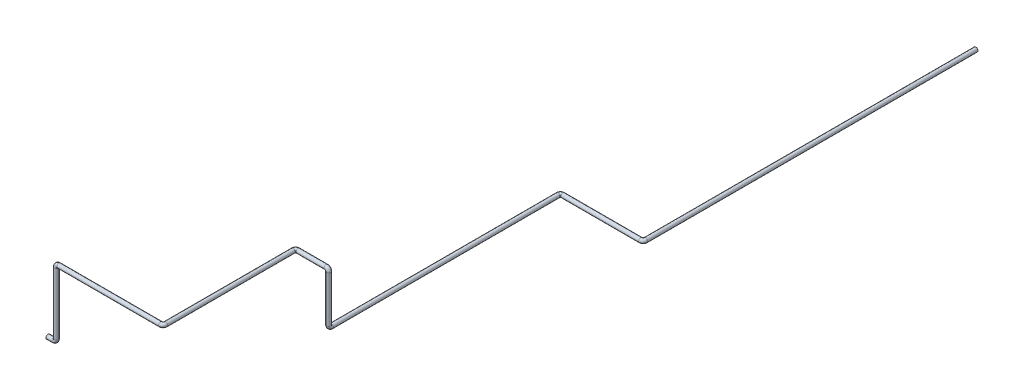
ISO-10303-21;
HEADER;
FILE_DESCRIPTION(('STEP AP214'),'2;1');
FILE_NAME('part.step','',(''),(''),'','','');
FILE_SCHEMA(('AUTOMOTIVE_DESIGN { 1 0 10303 214 1 1 1 1 }'));
ENDSEC;
DATA;
#1=APPLICATION_CONTEXT('core data for automotive mechanical design processes');
#2=APPLICATION_PROTOCOL_DEFINITION('international standard','automotive_design',2000,#1);
#3=PRODUCT_CONTEXT('',#1,'mechanical');
#4=PRODUCT('Part','Part','',(#3));
#5=PRODUCT_RELATED_PRODUCT_CATEGORY('part','',(#4));
#6=PRODUCT_DEFINITION_FORMATION('','',#4);
#7=PRODUCT_DEFINITION_CONTEXT('part definition',#1,'design');
#8=PRODUCT_DEFINITION('design','',#6,#7);
#9=PRODUCT_DEFINITION_SHAPE('','',#8);
#10=(LENGTH_UNIT() NAMED_UNIT(*) SI_UNIT(.MILLI.,.METRE.));
#11=(NAMED_UNIT(*) PLANE_ANGLE_UNIT() SI_UNIT($,.RADIAN.));
#12=(NAMED_UNIT(*) SI_UNIT($,.STERADIAN.) SOLID_ANGLE_UNIT());
#13=UNCERTAINTY_MEASURE_WITH_UNIT(LENGTH_MEASURE(1.E-05),#10,'distance_accuracy_value','');
#14=(GEOMETRIC_REPRESENTATION_CONTEXT(3) GLOBAL_UNCERTAINTY_ASSIGNED_CONTEXT((#13)) GLOBAL_UNIT_ASSIGNED_CONTEXT((#10,
#11,#12)) REPRESENTATION_CONTEXT('',''));
#15=CARTESIAN_POINT('',(0.,0.,0.));
#16=DIRECTION('',(0.,0.,1.));
#17=DIRECTION('',(1.,0.,0.));
#18=AXIS2_PLACEMENT_3D('',#15,#16,#17);
#19=CARTESIAN_POINT('',(0.,0.,10.));
#20=DIRECTION('',(0.,0.,-1.));
#21=DIRECTION('',(-1.,0.,0.));
#22=AXIS2_PLACEMENT_3D('',#19,#20,#21);
#23=CYLINDRICAL_SURFACE('',#22,12.7);
#24=CARTESIAN_POINT('',(0.,0.,0.999999999999999));
#25=DIRECTION('',(0.,0.,1.));
#26=DIRECTION('',(1.,0.,0.));
#27=AXIS2_PLACEMENT_3D('',#24,#25,#26);
#28=CIRCLE('',#27,12.7);
#29=CARTESIAN_POINT('',(0.0462735866728176,12.6999156987429,0.999999999999999));
#30=VERTEX_POINT('',#29);
#31=CARTESIAN_POINT('',(-0.0462735866728176,12.6999156987429,0.999999999999999));
#32=VERTEX_POINT('',#31);
#33=EDGE_CURVE('E11',#30,#32,#28,.T.);
#34=ORIENTED_EDGE('',*,*,#33,.T.);
#35=DIRECTION('',(0.,0.,-1.));
#36=VECTOR('',#35,1.);
#37=CARTESIAN_POINT('',(-0.0462735866728176,12.6999156987429,10.));
#38=LINE('',#37,#36);
#39=CARTESIAN_POINT('',(-0.0462735866728176,12.6999156987429,0.));
#40=VERTEX_POINT('',#39);
#41=EDGE_CURVE('E81',#32,#40,#38,.T.);
#42=ORIENTED_EDGE('',*,*,#41,.T.);
#43=CARTESIAN_POINT('',(0.,0.,0.));
#44=DIRECTION('',(0.,0.,1.));
#45=DIRECTION('',(1.,0.,0.));
#46=AXIS2_PLACEMENT_3D('',#43,#44,#45);
#47=CIRCLE('',#46,12.7);
#48=CARTESIAN_POINT('',(0.0462735866728176,12.6999156987429,0.));
#49=VERTEX_POINT('',#48);
#50=EDGE_CURVE('E42',#40,#49,#47,.T.);
#51=ORIENTED_EDGE('',*,*,#50,.T.);
#52=DIRECTION('',(0.,0.,-1.));
#53=VECTOR('',#52,1.);
#54=CARTESIAN_POINT('',(0.0462735866728176,12.6999156987429,10.));
#55=LINE('',#54,#53);
#56=EDGE_CURVE('E52',#49,#30,#55,.F.);
#57=ORIENTED_EDGE('',*,*,#56,.T.);
#58=EDGE_LOOP('',(#34,#42,#51,#57));
#59=FACE_BOUND('',#58,.T.);
#60=CARTESIAN_POINT('',(0.,0.,1995.));
#61=DIRECTION('',(0.,0.,1.));
#62=DIRECTION('',(1.,0.,0.));
#63=AXIS2_PLACEMENT_3D('',#60,#61,#62);
#64=CIRCLE('',#63,12.7);
#65=CARTESIAN_POINT('',(12.7,0.,1995.));
#66=VERTEX_POINT('',#65);
#67=EDGE_CURVE('E109',#66,#66,#64,.T.);
#68=ORIENTED_EDGE('',*,*,#67,.F.);
#69=EDGE_LOOP('',(#68));
#70=FACE_BOUND('',#69,.T.);
#71=ADVANCED_FACE('F35',(#59,#70),#23,.T.);
#72=CARTESIAN_POINT('',(0.,0.,0.));
#73=DIRECTION('',(0.,0.,1.));
#74=DIRECTION('',(1.,0.,0.));
#75=AXIS2_PLACEMENT_3D('',#72,#73,#74);
#76=PLANE('',#75);
#77=ORIENTED_EDGE('',*,*,#50,.F.);
#78=DIRECTION('',(0.,1.,0.));
#79=VECTOR('',#78,1.);
#80=CARTESIAN_POINT('',(-0.0462735866728176,12.675138552317,0.));
#81=LINE('',#80,#79);
#82=CARTESIAN_POINT('',(-0.0462735866728176,12.724861447683,0.));
#83=VERTEX_POINT('',#82);
#84=EDGE_CURVE('E101',#40,#83,#81,.T.);
#85=ORIENTED_EDGE('',*,*,#84,.T.);
#86=DIRECTION('',(1.,0.,0.));
#87=VECTOR('',#86,1.);
#88=CARTESIAN_POINT('',(0.0462735866728176,12.724861447683,0.));
#89=LINE('',#88,#87);
#90=CARTESIAN_POINT('',(0.0462735866728176,12.724861447683,0.));
#91=VERTEX_POINT('',#90);
#92=EDGE_CURVE('E91',#83,#91,#89,.T.);
#93=ORIENTED_EDGE('',*,*,#92,.T.);
#94=DIRECTION('',(0.,-1.,0.));
#95=VECTOR('',#94,1.);
#96=CARTESIAN_POINT('',(0.0462735866728176,12.675138552317,0.));
#97=LINE('',#96,#95);
#98=EDGE_CURVE('E85',#91,#49,#97,.T.);
#99=ORIENTED_EDGE('',*,*,#98,.T.);
#100=EDGE_LOOP('',(#77,#85,#93,#99));
#101=FACE_BOUND('',#100,.T.);
#102=ADVANCED_FACE('F163',(#101),#76,.F.);
#103=CARTESIAN_POINT('',(-1395.,-95.,4210.));
#104=DIRECTION('',(-1.,0.,0.));
#105=DIRECTION('',(0.,1.,0.));
#106=AXIS2_PLACEMENT_3D('',#103,#104,#105);
#107=PLANE('',#106);
#108=CARTESIAN_POINT('',(-1395.,-95.,4210.));
#109=DIRECTION('',(-1.,0.,0.));
#110=DIRECTION('',(0.,1.,0.));
#111=AXIS2_PLACEMENT_3D('',#108,#109,#110);
#112=CIRCLE('',#111,12.7);
#113=CARTESIAN_POINT('',(-1395.,-82.3,4210.));
#114=VERTEX_POINT('',#113);
#115=EDGE_CURVE('E157',#114,#114,#112,.T.);
#116=ORIENTED_EDGE('',*,*,#115,.T.);
#117=EDGE_LOOP('',(#116));
#118=FACE_BOUND('',#117,.T.);
#119=ADVANCED_FACE('F165',(#118),#107,.T.);
#120=CARTESIAN_POINT('',(-15.,0.,1995.));
#121=DIRECTION('',(0.,-1.,0.));
#122=DIRECTION('',(0.,0.,-1.));
#123=AXIS2_PLACEMENT_3D('',#120,#121,#122);
#124=TOROIDAL_SURFACE('',#123,15.,12.7);
#125=CARTESIAN_POINT('',(-15.,0.,2010.));
#126=DIRECTION('',(-1.,0.,0.));
#127=DIRECTION('',(0.,0.,1.));
#128=AXIS2_PLACEMENT_3D('',#125,#126,#127);
#129=CIRCLE('',#128,12.7);
#130=CARTESIAN_POINT('',(-15.,0.,2022.7));
#131=VERTEX_POINT('',#130);
#132=EDGE_CURVE('E112',#131,#131,#129,.T.);
#133=CARTESIAN_POINT('',(-15.,0.,1995.));
#134=DIRECTION('',(0.,-1.,0.));
#135=DIRECTION('',(0.,0.,-1.));
#136=AXIS2_PLACEMENT_3D('',#133,#134,#135);
#137=CIRCLE('',#136,27.6999999999999);
#138=EDGE_CURVE('',#66,#131,#137,.T.);
#139=ORIENTED_EDGE('',*,*,#67,.T.);
#140=ORIENTED_EDGE('',*,*,#132,.F.);
#141=ORIENTED_EDGE('',*,*,#138,.T.);
#142=ORIENTED_EDGE('',*,*,#138,.F.);
#143=EDGE_LOOP('',(#139,#141,#140,#142));
#144=FACE_BOUND('',#143,.T.);
#145=ADVANCED_FACE('F171',(#144),#124,.T.);
#146=CARTESIAN_POINT('',(-15.,0.,2010.));
#147=DIRECTION('',(-1.,0.,0.));
#148=DIRECTION('',(0.,0.,1.));
#149=AXIS2_PLACEMENT_3D('',#146,#147,#148);
#150=CYLINDRICAL_SURFACE('',#149,12.7);
#151=CARTESIAN_POINT('',(-485.,0.,2010.));
#152=DIRECTION('',(-1.,0.,0.));
#153=DIRECTION('',(0.,0.,1.));
#154=AXIS2_PLACEMENT_3D('',#151,#152,#153);
#155=CIRCLE('',#154,12.7);
#156=CARTESIAN_POINT('',(-485.,0.,1997.3));
#157=VERTEX_POINT('',#156);
#158=EDGE_CURVE('E115',#157,#157,#155,.T.);
#159=ORIENTED_EDGE('',*,*,#158,.F.);
#160=EDGE_LOOP('',(#159));
#161=FACE_BOUND('',#160,.T.);
#162=ORIENTED_EDGE('',*,*,#132,.T.);
#163=EDGE_LOOP('',(#162));
#164=FACE_BOUND('',#163,.T.);
#165=ADVANCED_FACE('F235',(#161,#164),#150,.T.);
#166=CARTESIAN_POINT('',(-485.,0.,2025.));
#167=DIRECTION('',(0.,1.,0.));
#168=DIRECTION('',(0.,0.,1.));
#169=AXIS2_PLACEMENT_3D('',#166,#167,#168);
#170=TOROIDAL_SURFACE('',#169,15.0000000000001,12.7);
#171=CARTESIAN_POINT('',(-500.,0.,2025.));
#172=DIRECTION('',(0.,0.,1.));
#173=DIRECTION('',(1.,0.,0.));
#174=AXIS2_PLACEMENT_3D('',#171,#172,#173);
#175=CIRCLE('',#174,12.7);
#176=CARTESIAN_POINT('',(-512.7,0.,2025.));
#177=VERTEX_POINT('',#176);
#178=EDGE_CURVE('E118',#177,#177,#175,.T.);
#179=CARTESIAN_POINT('',(-485.,0.,2025.));
#180=DIRECTION('',(0.,1.,0.));
#181=DIRECTION('',(0.,0.,1.));
#182=AXIS2_PLACEMENT_3D('',#179,#180,#181);
#183=CIRCLE('',#182,27.7000000000001);
#184=EDGE_CURVE('',#157,#177,#183,.T.);
#185=ORIENTED_EDGE('',*,*,#158,.T.);
#186=ORIENTED_EDGE('',*,*,#178,.F.);
#187=ORIENTED_EDGE('',*,*,#184,.T.);
#188=ORIENTED_EDGE('',*,*,#184,.F.);
#189=EDGE_LOOP('',(#185,#187,#186,#188));
#190=FACE_BOUND('',#189,.T.);
#191=ADVANCED_FACE('F231',(#190),#170,.T.);
#192=CARTESIAN_POINT('',(-500.,0.,2025.));
#193=DIRECTION('',(0.,0.,1.));
#194=DIRECTION('',(1.,0.,0.));
#195=AXIS2_PLACEMENT_3D('',#192,#193,#194);
#196=CYLINDRICAL_SURFACE('',#195,12.7);
#197=CARTESIAN_POINT('',(-500.,0.,3395.));
#198=DIRECTION('',(0.,0.,1.));
#199=DIRECTION('',(1.,0.,0.));
#200=AXIS2_PLACEMENT_3D('',#197,#198,#199);
#201=CIRCLE('',#200,12.7);
#202=CARTESIAN_POINT('',(-500.,-12.7000000000004,3395.));
#203=VERTEX_POINT('',#202);
#204=EDGE_CURVE('E121',#203,#203,#201,.T.);
#205=ORIENTED_EDGE('',*,*,#204,.F.);
#206=EDGE_LOOP('',(#205));
#207=FACE_BOUND('',#206,.T.);
#208=ORIENTED_EDGE('',*,*,#178,.T.);
#209=EDGE_LOOP('',(#208));
#210=FACE_BOUND('',#209,.T.);
#211=ADVANCED_FACE('F227',(#207,#210),#196,.T.);
#212=CARTESIAN_POINT('',(-500.,15.,3395.));
#213=DIRECTION('',(-1.,0.,0.));
#214=DIRECTION('',(0.,0.,1.));
#215=AXIS2_PLACEMENT_3D('',#212,#213,#214);
#216=TOROIDAL_SURFACE('',#215,15.0000000000004,12.7);
#217=CARTESIAN_POINT('',(-500.,15.,3410.));
#218=DIRECTION('',(0.,1.,0.));
#219=DIRECTION('',(1.,0.,0.));
#220=AXIS2_PLACEMENT_3D('',#217,#218,#219);
#221=CIRCLE('',#220,12.7);
#222=CARTESIAN_POINT('',(-500.,15.,3422.7));
#223=VERTEX_POINT('',#222);
#224=EDGE_CURVE('E124',#223,#223,#221,.T.);
#225=CARTESIAN_POINT('',(-500.,15.,3395.));
#226=DIRECTION('',(-1.,0.,0.));
#227=DIRECTION('',(0.,0.,1.));
#228=AXIS2_PLACEMENT_3D('',#225,#226,#227);
#229=CIRCLE('',#228,27.7000000000004);
#230=EDGE_CURVE('',#203,#223,#229,.T.);
#231=ORIENTED_EDGE('',*,*,#204,.T.);
#232=ORIENTED_EDGE('',*,*,#224,.F.);
#233=ORIENTED_EDGE('',*,*,#230,.T.);
#234=ORIENTED_EDGE('',*,*,#230,.F.);
#235=EDGE_LOOP('',(#231,#233,#232,#234));
#236=FACE_BOUND('',#235,.T.);
#237=ADVANCED_FACE('F223',(#236),#216,.T.);
#238=CARTESIAN_POINT('',(-500.,15.,3410.));
#239=DIRECTION('',(0.,1.,0.));
#240=DIRECTION('',(0.,0.,1.));
#241=AXIS2_PLACEMENT_3D('',#238,#239,#240);
#242=CYLINDRICAL_SURFACE('',#241,12.7);
#243=CARTESIAN_POINT('',(-500.,295.,3410.));
#244=DIRECTION('',(0.,1.,0.));
#245=DIRECTION('',(1.,0.,0.));
#246=AXIS2_PLACEMENT_3D('',#243,#244,#245);
#247=CIRCLE('',#246,12.7);
#248=CARTESIAN_POINT('',(-487.3,295.,3410.));
#249=VERTEX_POINT('',#248);
#250=EDGE_CURVE('E127',#249,#249,#247,.T.);
#251=ORIENTED_EDGE('',*,*,#250,.F.);
#252=EDGE_LOOP('',(#251));
#253=FACE_BOUND('',#252,.T.);
#254=ORIENTED_EDGE('',*,*,#224,.T.);
#255=EDGE_LOOP('',(#254));
#256=FACE_BOUND('',#255,.T.);
#257=ADVANCED_FACE('F219',(#253,#256),#242,.T.);
#258=CARTESIAN_POINT('',(-515.,295.,3410.));
#259=DIRECTION('',(0.,0.,1.));
#260=DIRECTION('',(1.,0.,0.));
#261=AXIS2_PLACEMENT_3D('',#258,#259,#260);
#262=TOROIDAL_SURFACE('',#261,15.,12.7);
#263=CARTESIAN_POINT('',(-515.,310.,3410.));
#264=DIRECTION('',(-1.,0.,0.));
#265=DIRECTION('',(0.,1.,0.));
#266=AXIS2_PLACEMENT_3D('',#263,#264,#265);
#267=CIRCLE('',#266,12.7);
#268=CARTESIAN_POINT('',(-515.,322.7,3410.));
#269=VERTEX_POINT('',#268);
#270=EDGE_CURVE('E130',#269,#269,#267,.T.);
#271=CARTESIAN_POINT('',(-515.,295.,3410.));
#272=DIRECTION('',(0.,0.,1.));
#273=DIRECTION('',(1.,0.,0.));
#274=AXIS2_PLACEMENT_3D('',#271,#272,#273);
#275=CIRCLE('',#274,27.7);
#276=EDGE_CURVE('',#249,#269,#275,.T.);
#277=ORIENTED_EDGE('',*,*,#250,.T.);
#278=ORIENTED_EDGE('',*,*,#270,.F.);
#279=ORIENTED_EDGE('',*,*,#276,.T.);
#280=ORIENTED_EDGE('',*,*,#276,.F.);
#281=EDGE_LOOP('',(#277,#279,#278,#280));
#282=FACE_BOUND('',#281,.T.);
#283=ADVANCED_FACE('F215',(#282),#262,.T.);
#284=CARTESIAN_POINT('',(-515.,310.,3410.));
#285=DIRECTION('',(-1.,0.,0.));
#286=DIRECTION('',(0.,0.,1.));
#287=AXIS2_PLACEMENT_3D('',#284,#285,#286);
#288=CYLINDRICAL_SURFACE('',#287,12.7);
#289=CARTESIAN_POINT('',(-685.,310.,3410.));
#290=DIRECTION('',(-1.,0.,0.));
#291=DIRECTION('',(0.,1.,0.));
#292=AXIS2_PLACEMENT_3D('',#289,#290,#291);
#293=CIRCLE('',#292,12.7);
#294=CARTESIAN_POINT('',(-685.,310.,3397.3));
#295=VERTEX_POINT('',#294);
#296=EDGE_CURVE('E133',#295,#295,#293,.T.);
#297=ORIENTED_EDGE('',*,*,#296,.F.);
#298=EDGE_LOOP('',(#297));
#299=FACE_BOUND('',#298,.T.);
#300=ORIENTED_EDGE('',*,*,#270,.T.);
#301=EDGE_LOOP('',(#300));
#302=FACE_BOUND('',#301,.T.);
#303=ADVANCED_FACE('F211',(#299,#302),#288,.T.);
#304=CARTESIAN_POINT('',(-685.,310.,3425.));
#305=DIRECTION('',(0.,1.,0.));
#306=DIRECTION('',(0.,0.,1.));
#307=AXIS2_PLACEMENT_3D('',#304,#305,#306);
#308=TOROIDAL_SURFACE('',#307,15.0000000000001,12.7);
#309=CARTESIAN_POINT('',(-700.,310.,3425.));
#310=DIRECTION('',(0.,0.,1.));
#311=DIRECTION('',(0.,1.,0.));
#312=AXIS2_PLACEMENT_3D('',#309,#310,#311);
#313=CIRCLE('',#312,12.7);
#314=CARTESIAN_POINT('',(-712.7,310.,3425.));
#315=VERTEX_POINT('',#314);
#316=EDGE_CURVE('E136',#315,#315,#313,.T.);
#317=CARTESIAN_POINT('',(-685.,310.,3425.));
#318=DIRECTION('',(0.,1.,0.));
#319=DIRECTION('',(0.,0.,1.));
#320=AXIS2_PLACEMENT_3D('',#317,#318,#319);
#321=CIRCLE('',#320,27.7000000000001);
#322=EDGE_CURVE('',#295,#315,#321,.T.);
#323=ORIENTED_EDGE('',*,*,#296,.T.);
#324=ORIENTED_EDGE('',*,*,#316,.F.);
#325=ORIENTED_EDGE('',*,*,#322,.T.);
#326=ORIENTED_EDGE('',*,*,#322,.F.);
#327=EDGE_LOOP('',(#323,#325,#324,#326));
#328=FACE_BOUND('',#327,.T.);
#329=ADVANCED_FACE('F207',(#328),#308,.T.);
#330=CARTESIAN_POINT('',(-700.,310.,3425.));
#331=DIRECTION('',(0.,0.,1.));
#332=DIRECTION('',(1.,0.,0.));
#333=AXIS2_PLACEMENT_3D('',#330,#331,#332);
#334=CYLINDRICAL_SURFACE('',#333,12.7);
#335=CARTESIAN_POINT('',(-700.,310.,4195.));
#336=DIRECTION('',(0.,0.,1.));
#337=DIRECTION('',(0.,1.,0.));
#338=AXIS2_PLACEMENT_3D('',#335,#336,#337);
#339=CIRCLE('',#338,12.7);
#340=CARTESIAN_POINT('',(-687.3,310.,4195.));
#341=VERTEX_POINT('',#340);
#342=EDGE_CURVE('E139',#341,#341,#339,.T.);
#343=ORIENTED_EDGE('',*,*,#342,.F.);
#344=EDGE_LOOP('',(#343));
#345=FACE_BOUND('',#344,.T.);
#346=ORIENTED_EDGE('',*,*,#316,.T.);
#347=EDGE_LOOP('',(#346));
#348=FACE_BOUND('',#347,.T.);
#349=ADVANCED_FACE('F203',(#345,#348),#334,.T.);
#350=CARTESIAN_POINT('',(-715.,310.,4195.));
#351=DIRECTION('',(0.,-1.,0.));
#352=DIRECTION('',(0.,0.,-1.));
#353=AXIS2_PLACEMENT_3D('',#350,#351,#352);
#354=TOROIDAL_SURFACE('',#353,14.9999999999998,12.7);
#355=CARTESIAN_POINT('',(-715.,310.,4210.));
#356=DIRECTION('',(-1.,0.,0.));
#357=DIRECTION('',(0.,1.,0.));
#358=AXIS2_PLACEMENT_3D('',#355,#356,#357);
#359=CIRCLE('',#358,12.7);
#360=CARTESIAN_POINT('',(-715.,310.,4222.7));
#361=VERTEX_POINT('',#360);
#362=EDGE_CURVE('E142',#361,#361,#359,.T.);
#363=CARTESIAN_POINT('',(-715.,310.,4195.));
#364=DIRECTION('',(0.,-1.,0.));
#365=DIRECTION('',(0.,0.,-1.));
#366=AXIS2_PLACEMENT_3D('',#363,#364,#365);
#367=CIRCLE('',#366,27.6999999999998);
#368=EDGE_CURVE('',#341,#361,#367,.T.);
#369=ORIENTED_EDGE('',*,*,#342,.T.);
#370=ORIENTED_EDGE('',*,*,#362,.F.);
#371=ORIENTED_EDGE('',*,*,#368,.T.);
#372=ORIENTED_EDGE('',*,*,#368,.F.);
#373=EDGE_LOOP('',(#369,#371,#370,#372));
#374=FACE_BOUND('',#373,.T.);
#375=ADVANCED_FACE('F199',(#374),#354,.T.);
#376=CARTESIAN_POINT('',(-715.,310.,4210.));
#377=DIRECTION('',(-1.,0.,0.));
#378=DIRECTION('',(0.,0.,1.));
#379=AXIS2_PLACEMENT_3D('',#376,#377,#378);
#380=CYLINDRICAL_SURFACE('',#379,12.7);
#381=CARTESIAN_POINT('',(-1330.,310.,4210.));
#382=DIRECTION('',(-1.,0.,0.));
#383=DIRECTION('',(0.,1.,0.));
#384=AXIS2_PLACEMENT_3D('',#381,#382,#383);
#385=CIRCLE('',#384,12.7);
#386=CARTESIAN_POINT('',(-1330.,322.7,4210.));
#387=VERTEX_POINT('',#386);
#388=EDGE_CURVE('E145',#387,#387,#385,.T.);
#389=ORIENTED_EDGE('',*,*,#388,.F.);
#390=EDGE_LOOP('',(#389));
#391=FACE_BOUND('',#390,.T.);
#392=ORIENTED_EDGE('',*,*,#362,.T.);
#393=EDGE_LOOP('',(#392));
#394=FACE_BOUND('',#393,.T.);
#395=ADVANCED_FACE('F195',(#391,#394),#380,.T.);
#396=CARTESIAN_POINT('',(-1330.,295.,4210.));
#397=DIRECTION('',(0.,0.,1.));
#398=DIRECTION('',(1.,0.,0.));
#399=AXIS2_PLACEMENT_3D('',#396,#397,#398);
#400=TOROIDAL_SURFACE('',#399,15.,12.7);
#401=CARTESIAN_POINT('',(-1345.,295.,4210.));
#402=DIRECTION('',(0.,-1.,0.));
#403=DIRECTION('',(-1.,0.,0.));
#404=AXIS2_PLACEMENT_3D('',#401,#402,#403);
#405=CIRCLE('',#404,12.7);
#406=CARTESIAN_POINT('',(-1357.7,295.,4210.));
#407=VERTEX_POINT('',#406);
#408=EDGE_CURVE('E148',#407,#407,#405,.T.);
#409=CARTESIAN_POINT('',(-1330.,295.,4210.));
#410=DIRECTION('',(0.,0.,1.));
#411=DIRECTION('',(1.,0.,0.));
#412=AXIS2_PLACEMENT_3D('',#409,#410,#411);
#413=CIRCLE('',#412,27.7);
#414=EDGE_CURVE('',#387,#407,#413,.T.);
#415=ORIENTED_EDGE('',*,*,#388,.T.);
#416=ORIENTED_EDGE('',*,*,#408,.F.);
#417=ORIENTED_EDGE('',*,*,#414,.T.);
#418=ORIENTED_EDGE('',*,*,#414,.F.);
#419=EDGE_LOOP('',(#415,#417,#416,#418));
#420=FACE_BOUND('',#419,.T.);
#421=ADVANCED_FACE('F191',(#420),#400,.T.);
#422=CARTESIAN_POINT('',(-1345.,295.,4210.));
#423=DIRECTION('',(0.,-1.,0.));
#424=DIRECTION('',(0.,0.,-1.));
#425=AXIS2_PLACEMENT_3D('',#422,#423,#424);
#426=CYLINDRICAL_SURFACE('',#425,12.7);
#427=CARTESIAN_POINT('',(-1345.,-80.,4210.));
#428=DIRECTION('',(0.,-1.,0.));
#429=DIRECTION('',(-1.,0.,0.));
#430=AXIS2_PLACEMENT_3D('',#427,#428,#429);
#431=CIRCLE('',#430,12.7);
#432=CARTESIAN_POINT('',(-1332.3,-80.,4210.));
#433=VERTEX_POINT('',#432);
#434=EDGE_CURVE('E151',#433,#433,#431,.T.);
#435=ORIENTED_EDGE('',*,*,#434,.F.);
#436=EDGE_LOOP('',(#435));
#437=FACE_BOUND('',#436,.T.);
#438=ORIENTED_EDGE('',*,*,#408,.T.);
#439=EDGE_LOOP('',(#438));
#440=FACE_BOUND('',#439,.T.);
#441=ADVANCED_FACE('F183',(#437,#440),#426,.T.);
#442=CARTESIAN_POINT('',(-1360.,-80.,4210.));
#443=DIRECTION('',(0.,0.,-1.));
#444=DIRECTION('',(-1.,0.,0.));
#445=AXIS2_PLACEMENT_3D('',#442,#443,#444);
#446=TOROIDAL_SURFACE('',#445,14.9999999999999,12.7);
#447=CARTESIAN_POINT('',(-1360.,-95.,4210.));
#448=DIRECTION('',(-1.,0.,0.));
#449=DIRECTION('',(0.,1.,0.));
#450=AXIS2_PLACEMENT_3D('',#447,#448,#449);
#451=CIRCLE('',#450,12.7);
#452=CARTESIAN_POINT('',(-1360.,-107.7,4210.));
#453=VERTEX_POINT('',#452);
#454=EDGE_CURVE('E154',#453,#453,#451,.T.);
#455=CARTESIAN_POINT('',(-1360.,-80.,4210.));
#456=DIRECTION('',(0.,0.,-1.));
#457=DIRECTION('',(-1.,0.,0.));
#458=AXIS2_PLACEMENT_3D('',#455,#456,#457);
#459=CIRCLE('',#458,27.6999999999999);
#460=EDGE_CURVE('',#433,#453,#459,.T.);
#461=ORIENTED_EDGE('',*,*,#434,.T.);
#462=ORIENTED_EDGE('',*,*,#454,.F.);
#463=ORIENTED_EDGE('',*,*,#460,.T.);
#464=ORIENTED_EDGE('',*,*,#460,.F.);
#465=EDGE_LOOP('',(#461,#463,#462,#464));
#466=FACE_BOUND('',#465,.T.);
#467=ADVANCED_FACE('F175',(#466),#446,.T.);
#468=CARTESIAN_POINT('',(-1360.,-95.,4210.));
#469=DIRECTION('',(-1.,0.,0.));
#470=DIRECTION('',(0.,0.,1.));
#471=AXIS2_PLACEMENT_3D('',#468,#469,#470);
#472=CYLINDRICAL_SURFACE('',#471,12.7);
#473=ORIENTED_EDGE('',*,*,#115,.F.);
#474=EDGE_LOOP('',(#473));
#475=FACE_BOUND('',#474,.T.);
#476=ORIENTED_EDGE('',*,*,#454,.T.);
#477=EDGE_LOOP('',(#476));
#478=FACE_BOUND('',#477,.T.);
#479=ADVANCED_FACE('F166',(#475,#478),#472,.T.);
#480=CARTESIAN_POINT('',(-0.0462735866728176,12.675138552317,1.));
#481=DIRECTION('',(-1.,0.,0.));
#482=DIRECTION('',(0.,0.,1.));
#483=AXIS2_PLACEMENT_3D('',#480,#481,#482);
#484=PLANE('',#483);
#485=ORIENTED_EDGE('',*,*,#41,.F.);
#486=DIRECTION('',(0.,1.,0.));
#487=VECTOR('',#486,1.);
#488=CARTESIAN_POINT('',(-0.0462735866728176,12.675138552317,1.));
#489=LINE('',#488,#487);
#490=CARTESIAN_POINT('',(-0.0462735866728176,12.724861447683,1.));
#491=VERTEX_POINT('',#490);
#492=EDGE_CURVE('E75',#32,#491,#489,.T.);
#493=ORIENTED_EDGE('',*,*,#492,.T.);
#494=DIRECTION('',(0.,0.,-1.));
#495=VECTOR('',#494,1.);
#496=CARTESIAN_POINT('',(-0.0462735866728176,12.724861447683,1.));
#497=LINE('',#496,#495);
#498=EDGE_CURVE('E79',#491,#83,#497,.T.);
#499=ORIENTED_EDGE('',*,*,#498,.T.);
#500=ORIENTED_EDGE('',*,*,#84,.F.);
#501=EDGE_LOOP('',(#485,#493,#499,#500));
#502=FACE_BOUND('',#501,.T.);
#503=ADVANCED_FACE('F77',(#502),#484,.T.);
#504=CARTESIAN_POINT('',(0.0462735866728176,12.675138552317,1.));
#505=DIRECTION('',(1.,0.,0.));
#506=DIRECTION('',(0.,0.,-1.));
#507=AXIS2_PLACEMENT_3D('',#504,#505,#506);
#508=PLANE('',#507);
#509=ORIENTED_EDGE('',*,*,#56,.F.);
#510=ORIENTED_EDGE('',*,*,#98,.F.);
#511=DIRECTION('',(0.,0.,-1.));
#512=VECTOR('',#511,1.);
#513=CARTESIAN_POINT('',(0.0462735866728176,12.724861447683,1.));
#514=LINE('',#513,#512);
#515=CARTESIAN_POINT('',(0.0462735866728176,12.724861447683,1.));
#516=VERTEX_POINT('',#515);
#517=EDGE_CURVE('E92',#516,#91,#514,.T.);
#518=ORIENTED_EDGE('',*,*,#517,.F.);
#519=DIRECTION('',(0.,-1.,0.));
#520=VECTOR('',#519,1.);
#521=CARTESIAN_POINT('',(0.0462735866728176,12.675138552317,1.));
#522=LINE('',#521,#520);
#523=EDGE_CURVE('E93',#516,#30,#522,.T.);
#524=ORIENTED_EDGE('',*,*,#523,.T.);
#525=EDGE_LOOP('',(#509,#510,#518,#524));
#526=FACE_BOUND('',#525,.T.);
#527=ADVANCED_FACE('F162',(#526),#508,.T.);
#528=CARTESIAN_POINT('',(0.0462735866728176,12.724861447683,1.));
#529=DIRECTION('',(0.,1.,0.));
#530=DIRECTION('',(0.,0.,1.));
#531=AXIS2_PLACEMENT_3D('',#528,#529,#530);
#532=PLANE('',#531);
#533=ORIENTED_EDGE('',*,*,#92,.F.);
#534=ORIENTED_EDGE('',*,*,#498,.F.);
#535=DIRECTION('',(1.,0.,0.));
#536=VECTOR('',#535,1.);
#537=CARTESIAN_POINT('',(0.0462735866728176,12.724861447683,1.));
#538=LINE('',#537,#536);
#539=EDGE_CURVE('E84',#491,#516,#538,.T.);
#540=ORIENTED_EDGE('',*,*,#539,.T.);
#541=ORIENTED_EDGE('',*,*,#517,.T.);
#542=EDGE_LOOP('',(#533,#534,#540,#541));
#543=FACE_BOUND('',#542,.T.);
#544=ADVANCED_FACE('F89',(#543),#532,.T.);
#545=CARTESIAN_POINT('',(0.,0.,1.));
#546=DIRECTION('',(0.,0.,1.));
#547=DIRECTION('',(1.,0.,0.));
#548=AXIS2_PLACEMENT_3D('',#545,#546,#547);
#549=PLANE('',#548);
#550=ORIENTED_EDGE('',*,*,#33,.F.);
#551=ORIENTED_EDGE('',*,*,#523,.F.);
#552=ORIENTED_EDGE('',*,*,#539,.F.);
#553=ORIENTED_EDGE('',*,*,#492,.F.);
#554=EDGE_LOOP('',(#550,#551,#552,#553));
#555=FACE_BOUND('',#554,.T.);
#556=ADVANCED_FACE('F96',(#555),#549,.T.);
#557=CLOSED_SHELL('',(#71,#102,#119,#145,#165,#191,#211,#237,#257,#283,#303,#329,#349,#375,#395,
#421,#441,#467,#479,#503,#527,#544,#556));
#558=MANIFOLD_SOLID_BREP('B2',#557);
#559=ADVANCED_BREP_SHAPE_REPRESENTATION('',(#18,#558),#14);
#560=SHAPE_DEFINITION_REPRESENTATION(#9,#559);
ENDSEC;
END-ISO-10303-21;
